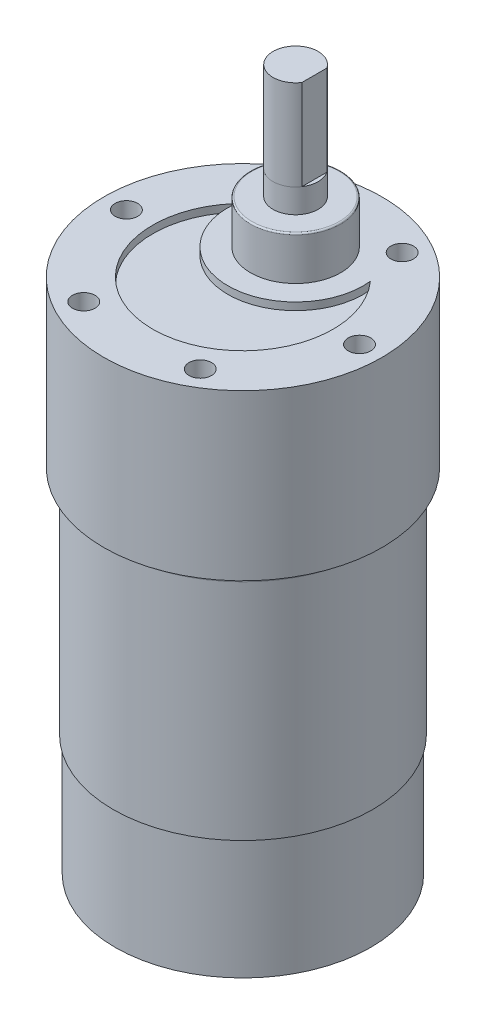
ISO-10303-21;
HEADER;
FILE_DESCRIPTION(('STEP AP214'),'2;1');
FILE_NAME('part.step','',(''),(''),'','','');
FILE_SCHEMA(('AUTOMOTIVE_DESIGN { 1 0 10303 214 1 1 1 1 }'));
ENDSEC;
DATA;
#1=APPLICATION_CONTEXT('core data for automotive mechanical design processes');
#2=APPLICATION_PROTOCOL_DEFINITION('international standard','automotive_design',2000,#1);
#3=PRODUCT_CONTEXT('',#1,'mechanical');
#4=PRODUCT('Part','Part','',(#3));
#5=PRODUCT_RELATED_PRODUCT_CATEGORY('part','',(#4));
#6=PRODUCT_DEFINITION_FORMATION('','',#4);
#7=PRODUCT_DEFINITION_CONTEXT('part definition',#1,'design');
#8=PRODUCT_DEFINITION('design','',#6,#7);
#9=PRODUCT_DEFINITION_SHAPE('','',#8);
#10=(LENGTH_UNIT() NAMED_UNIT(*) SI_UNIT(.MILLI.,.METRE.));
#11=(NAMED_UNIT(*) PLANE_ANGLE_UNIT() SI_UNIT($,.RADIAN.));
#12=(NAMED_UNIT(*) SI_UNIT($,.STERADIAN.) SOLID_ANGLE_UNIT());
#13=UNCERTAINTY_MEASURE_WITH_UNIT(LENGTH_MEASURE(1.E-05),#10,'distance_accuracy_value','');
#14=(GEOMETRIC_REPRESENTATION_CONTEXT(3) GLOBAL_UNCERTAINTY_ASSIGNED_CONTEXT((#13)) GLOBAL_UNIT_ASSIGNED_CONTEXT((#10,
#11,#12)) REPRESENTATION_CONTEXT('',''));
#15=CARTESIAN_POINT('',(0.,0.,0.));
#16=DIRECTION('',(0.,0.,1.));
#17=DIRECTION('',(1.,0.,0.));
#18=AXIS2_PLACEMENT_3D('',#15,#16,#17);
#19=CARTESIAN_POINT('',(0.,-16.,0.));
#20=DIRECTION('',(0.,1.,0.));
#21=DIRECTION('',(0.,0.,1.));
#22=AXIS2_PLACEMENT_3D('',#19,#20,#21);
#23=CYLINDRICAL_SURFACE('',#22,17.);
#24=CARTESIAN_POINT('',(0.,-16.,0.));
#25=DIRECTION('',(0.,-1.,0.));
#26=DIRECTION('',(0.,0.,-1.));
#27=AXIS2_PLACEMENT_3D('',#24,#25,#26);
#28=CIRCLE('',#27,17.);
#29=CARTESIAN_POINT('',(0.,-16.,-17.));
#30=VERTEX_POINT('',#29);
#31=EDGE_CURVE('E11',#30,#30,#28,.T.);
#32=ORIENTED_EDGE('',*,*,#31,.F.);
#33=EDGE_LOOP('',(#32));
#34=FACE_BOUND('',#33,.T.);
#35=CARTESIAN_POINT('',(0.,0.,0.));
#36=DIRECTION('',(0.,-1.,0.));
#37=DIRECTION('',(0.,0.,-1.));
#38=AXIS2_PLACEMENT_3D('',#35,#36,#37);
#39=CIRCLE('',#38,17.);
#40=CARTESIAN_POINT('',(0.,0.,-17.));
#41=VERTEX_POINT('',#40);
#42=EDGE_CURVE('E55',#41,#41,#39,.T.);
#43=ORIENTED_EDGE('',*,*,#42,.T.);
#44=EDGE_LOOP('',(#43));
#45=FACE_BOUND('',#44,.T.);
#46=ADVANCED_FACE('F52',(#34,#45),#23,.T.);
#47=CARTESIAN_POINT('',(0.,-16.,0.));
#48=DIRECTION('',(0.,-1.,0.));
#49=DIRECTION('',(0.,0.,-1.));
#50=AXIS2_PLACEMENT_3D('',#47,#48,#49);
#51=PLANE('',#50);
#52=ORIENTED_EDGE('',*,*,#31,.T.);
#53=EDGE_LOOP('',(#52));
#54=FACE_BOUND('',#53,.T.);
#55=ADVANCED_FACE('F67',(#54),#51,.T.);
#56=CARTESIAN_POINT('',(0.,0.,0.));
#57=DIRECTION('',(0.,-1.,0.));
#58=DIRECTION('',(0.,0.,-1.));
#59=AXIS2_PLACEMENT_3D('',#56,#57,#58);
#60=PLANE('',#59);
#61=ORIENTED_EDGE('',*,*,#42,.F.);
#62=EDGE_LOOP('',(#61));
#63=FACE_BOUND('',#62,.T.);
#64=ADVANCED_FACE('F65',(#63),#60,.F.);
#65=CLOSED_SHELL('',(#46,#55,#64));
#66=MANIFOLD_SOLID_BREP('B2',#65);
#67=CARTESIAN_POINT('',(0.,73.7,-7.));
#68=DIRECTION('',(0.,-1.,0.));
#69=DIRECTION('',(0.,0.,-1.));
#70=AXIS2_PLACEMENT_3D('',#67,#68,#69);
#71=CYLINDRICAL_SURFACE('',#70,3.);
#72=CARTESIAN_POINT('',(0.,61.7,-7.));
#73=DIRECTION('',(0.,1.,0.));
#74=DIRECTION('',(0.,0.,1.));
#75=AXIS2_PLACEMENT_3D('',#72,#73,#74);
#76=CIRCLE('',#75,3.);
#77=CARTESIAN_POINT('',(2.5,61.7,-8.6583123951777));
#78=VERTEX_POINT('',#77);
#79=CARTESIAN_POINT('',(2.5,61.7,-5.3416876048223));
#80=VERTEX_POINT('',#79);
#81=EDGE_CURVE('E134',#78,#80,#76,.T.);
#82=ORIENTED_EDGE('',*,*,#81,.T.);
#83=DIRECTION('',(0.,-1.,0.));
#84=VECTOR('',#83,1.);
#85=CARTESIAN_POINT('',(2.5,73.7,-5.3416876048223));
#86=LINE('',#85,#84);
#87=CARTESIAN_POINT('',(2.5,73.7,-5.3416876048223));
#88=VERTEX_POINT('',#87);
#89=EDGE_CURVE('E50',#88,#80,#86,.T.);
#90=ORIENTED_EDGE('',*,*,#89,.F.);
#91=CARTESIAN_POINT('',(0.,73.7,-7.));
#92=DIRECTION('',(0.,1.,0.));
#93=DIRECTION('',(0.,0.,1.));
#94=AXIS2_PLACEMENT_3D('',#91,#92,#93);
#95=CIRCLE('',#94,3.);
#96=CARTESIAN_POINT('',(2.5,73.7,-8.6583123951777));
#97=VERTEX_POINT('',#96);
#98=EDGE_CURVE('E133',#97,#88,#95,.T.);
#99=ORIENTED_EDGE('',*,*,#98,.F.);
#100=DIRECTION('',(0.,-1.,0.));
#101=VECTOR('',#100,1.);
#102=CARTESIAN_POINT('',(2.5,73.7,-8.6583123951777));
#103=LINE('',#102,#101);
#104=EDGE_CURVE('E111',#97,#78,#103,.T.);
#105=ORIENTED_EDGE('',*,*,#104,.T.);
#106=EDGE_LOOP('',(#82,#90,#99,#105));
#107=FACE_BOUND('',#106,.T.);
#108=ADVANCED_FACE('F103',(#107),#71,.T.);
#109=CARTESIAN_POINT('',(2.5,73.7,-8.6583123951777));
#110=DIRECTION('',(-1.,0.,0.));
#111=DIRECTION('',(0.,0.,1.));
#112=AXIS2_PLACEMENT_3D('',#109,#110,#111);
#113=PLANE('',#112);
#114=DIRECTION('',(0.,0.,-1.));
#115=VECTOR('',#114,1.);
#116=CARTESIAN_POINT('',(2.5,61.7,-8.6583123951777));
#117=LINE('',#116,#115);
#118=EDGE_CURVE('E126',#80,#78,#117,.T.);
#119=ORIENTED_EDGE('',*,*,#118,.T.);
#120=ORIENTED_EDGE('',*,*,#104,.F.);
#121=DIRECTION('',(0.,0.,-1.));
#122=VECTOR('',#121,1.);
#123=CARTESIAN_POINT('',(2.5,73.7,-8.6583123951777));
#124=LINE('',#123,#122);
#125=EDGE_CURVE('E118',#88,#97,#124,.T.);
#126=ORIENTED_EDGE('',*,*,#125,.F.);
#127=ORIENTED_EDGE('',*,*,#89,.T.);
#128=EDGE_LOOP('',(#119,#120,#126,#127));
#129=FACE_BOUND('',#128,.T.);
#130=ADVANCED_FACE('F129',(#129),#113,.F.);
#131=CARTESIAN_POINT('',(0.,73.7,-7.));
#132=DIRECTION('',(0.,1.,0.));
#133=DIRECTION('',(0.,0.,1.));
#134=AXIS2_PLACEMENT_3D('',#131,#132,#133);
#135=PLANE('',#134);
#136=ORIENTED_EDGE('',*,*,#98,.T.);
#137=ORIENTED_EDGE('',*,*,#125,.T.);
#138=EDGE_LOOP('',(#136,#137));
#139=FACE_BOUND('',#138,.T.);
#140=ADVANCED_FACE('F141',(#139),#135,.T.);
#141=CARTESIAN_POINT('',(0.,61.7,-7.));
#142=DIRECTION('',(0.,1.,0.));
#143=DIRECTION('',(0.,0.,1.));
#144=AXIS2_PLACEMENT_3D('',#141,#142,#143);
#145=PLANE('',#144);
#146=ORIENTED_EDGE('',*,*,#81,.F.);
#147=ORIENTED_EDGE('',*,*,#118,.F.);
#148=EDGE_LOOP('',(#146,#147));
#149=FACE_BOUND('',#148,.T.);
#150=ADVANCED_FACE('F137',(#149),#145,.F.);
#151=CLOSED_SHELL('',(#108,#130,#140,#150));
#152=MANIFOLD_SOLID_BREP('B6',#151);
#153=CARTESIAN_POINT('',(0.,61.7,-7.));
#154=DIRECTION('',(0.,-1.,0.));
#155=DIRECTION('',(0.,0.,-1.));
#156=AXIS2_PLACEMENT_3D('',#153,#154,#155);
#157=CYLINDRICAL_SURFACE('',#156,3.);
#158=CARTESIAN_POINT('',(0.,61.7,-7.));
#159=DIRECTION('',(0.,1.,0.));
#160=DIRECTION('',(0.,0.,1.));
#161=AXIS2_PLACEMENT_3D('',#158,#159,#160);
#162=CIRCLE('',#161,3.);
#163=CARTESIAN_POINT('',(0.,61.7,-4.));
#164=VERTEX_POINT('',#163);
#165=EDGE_CURVE('E102',#164,#164,#162,.T.);
#166=ORIENTED_EDGE('',*,*,#165,.F.);
#167=EDGE_LOOP('',(#166));
#168=FACE_BOUND('',#167,.T.);
#169=CARTESIAN_POINT('',(0.,58.5,-7.));
#170=DIRECTION('',(0.,1.,0.));
#171=DIRECTION('',(0.,0.,1.));
#172=AXIS2_PLACEMENT_3D('',#169,#170,#171);
#173=CIRCLE('',#172,3.);
#174=CARTESIAN_POINT('',(0.,58.5,-4.));
#175=VERTEX_POINT('',#174);
#176=EDGE_CURVE('E188',#175,#175,#173,.T.);
#177=ORIENTED_EDGE('',*,*,#176,.T.);
#178=EDGE_LOOP('',(#177));
#179=FACE_BOUND('',#178,.T.);
#180=ADVANCED_FACE('F185',(#168,#179),#157,.T.);
#181=CARTESIAN_POINT('',(0.,61.7,-7.));
#182=DIRECTION('',(0.,1.,0.));
#183=DIRECTION('',(0.,0.,1.));
#184=AXIS2_PLACEMENT_3D('',#181,#182,#183);
#185=PLANE('',#184);
#186=ORIENTED_EDGE('',*,*,#165,.T.);
#187=EDGE_LOOP('',(#186));
#188=FACE_BOUND('',#187,.T.);
#189=ADVANCED_FACE('F200',(#188),#185,.T.);
#190=CARTESIAN_POINT('',(0.,58.5,-7.));
#191=DIRECTION('',(0.,1.,0.));
#192=DIRECTION('',(0.,0.,1.));
#193=AXIS2_PLACEMENT_3D('',#190,#191,#192);
#194=PLANE('',#193);
#195=ORIENTED_EDGE('',*,*,#176,.F.);
#196=EDGE_LOOP('',(#195));
#197=FACE_BOUND('',#196,.T.);
#198=ADVANCED_FACE('F198',(#197),#194,.F.);
#199=CLOSED_SHELL('',(#180,#189,#198));
#200=MANIFOLD_SOLID_BREP('B44',#199);
#201=CARTESIAN_POINT('',(0.,58.5,-7.));
#202=DIRECTION('',(0.,-1.,0.));
#203=DIRECTION('',(0.,0.,-1.));
#204=AXIS2_PLACEMENT_3D('',#201,#202,#203);
#205=CYLINDRICAL_SURFACE('',#204,6.);
#206=CARTESIAN_POINT('',(0.,58.3,-7.));
#207=DIRECTION('',(0.,1.,0.));
#208=DIRECTION('',(0.,0.,1.));
#209=AXIS2_PLACEMENT_3D('',#206,#207,#208);
#210=CIRCLE('',#209,6.);
#211=CARTESIAN_POINT('',(0.,58.3,-0.999999999999999));
#212=VERTEX_POINT('',#211);
#213=EDGE_CURVE('E184',#212,#212,#210,.F.);
#214=ORIENTED_EDGE('',*,*,#213,.T.);
#215=EDGE_LOOP('',(#214));
#216=FACE_BOUND('',#215,.T.);
#217=CARTESIAN_POINT('',(0.,52.7,-7.));
#218=DIRECTION('',(0.,1.,0.));
#219=DIRECTION('',(0.,0.,1.));
#220=AXIS2_PLACEMENT_3D('',#217,#218,#219);
#221=CIRCLE('',#220,6.);
#222=CARTESIAN_POINT('',(0.,52.7,-0.999999999999999));
#223=VERTEX_POINT('',#222);
#224=EDGE_CURVE('E249',#223,#223,#221,.T.);
#225=ORIENTED_EDGE('',*,*,#224,.T.);
#226=EDGE_LOOP('',(#225));
#227=FACE_BOUND('',#226,.T.);
#228=ADVANCED_FACE('F238',(#216,#227),#205,.T.);
#229=CARTESIAN_POINT('',(0.,58.5,-7.));
#230=DIRECTION('',(0.,1.,0.));
#231=DIRECTION('',(0.,0.,1.));
#232=AXIS2_PLACEMENT_3D('',#229,#230,#231);
#233=PLANE('',#232);
#234=CARTESIAN_POINT('',(0.,58.5,-7.));
#235=DIRECTION('',(0.,1.,0.));
#236=DIRECTION('',(0.,0.,1.));
#237=AXIS2_PLACEMENT_3D('',#234,#235,#236);
#238=CIRCLE('',#237,5.8);
#239=CARTESIAN_POINT('',(0.,58.5,-1.2));
#240=VERTEX_POINT('',#239);
#241=EDGE_CURVE('E245',#240,#240,#238,.T.);
#242=ORIENTED_EDGE('',*,*,#241,.T.);
#243=EDGE_LOOP('',(#242));
#244=FACE_BOUND('',#243,.T.);
#245=ADVANCED_FACE('F259',(#244),#233,.T.);
#246=CARTESIAN_POINT('',(0.,52.7,-7.));
#247=DIRECTION('',(0.,1.,0.));
#248=DIRECTION('',(0.,0.,1.));
#249=AXIS2_PLACEMENT_3D('',#246,#247,#248);
#250=PLANE('',#249);
#251=ORIENTED_EDGE('',*,*,#224,.F.);
#252=EDGE_LOOP('',(#251));
#253=FACE_BOUND('',#252,.T.);
#254=ADVANCED_FACE('F257',(#253),#250,.F.);
#255=CARTESIAN_POINT('',(0.,58.3,-7.));
#256=DIRECTION('',(0.,1.,0.));
#257=DIRECTION('',(0.,0.,1.));
#258=AXIS2_PLACEMENT_3D('',#255,#256,#257);
#259=TOROIDAL_SURFACE('',#258,5.8,0.2);
#260=ORIENTED_EDGE('',*,*,#213,.F.);
#261=EDGE_LOOP('',(#260));
#262=FACE_BOUND('',#261,.T.);
#263=ORIENTED_EDGE('',*,*,#241,.F.);
#264=EDGE_LOOP('',(#263));
#265=FACE_BOUND('',#264,.T.);
#266=ADVANCED_FACE('F240',(#262,#265),#259,.T.);
#267=CLOSED_SHELL('',(#228,#245,#254,#266));
#268=MANIFOLD_SOLID_BREP('B97',#267);
#269=CARTESIAN_POINT('',(0.,52.7,0.));
#270=DIRECTION('',(0.,-1.,0.));
#271=DIRECTION('',(0.,0.,-1.));
#272=AXIS2_PLACEMENT_3D('',#269,#270,#271);
#273=CYLINDRICAL_SURFACE('',#272,18.5);
#274=CARTESIAN_POINT('',(0.,52.7,0.));
#275=DIRECTION('',(0.,1.,0.));
#276=DIRECTION('',(0.,0.,1.));
#277=AXIS2_PLACEMENT_3D('',#274,#275,#276);
#278=CIRCLE('',#277,18.5);
#279=CARTESIAN_POINT('',(0.,52.7,18.5));
#280=VERTEX_POINT('',#279);
#281=EDGE_CURVE('E236',#280,#280,#278,.T.);
#282=ORIENTED_EDGE('',*,*,#281,.F.);
#283=EDGE_LOOP('',(#282));
#284=FACE_BOUND('',#283,.T.);
#285=CARTESIAN_POINT('',(0.,30.8,0.));
#286=DIRECTION('',(0.,1.,0.));
#287=DIRECTION('',(0.,0.,1.));
#288=AXIS2_PLACEMENT_3D('',#285,#286,#287);
#289=CIRCLE('',#288,18.5);
#290=CARTESIAN_POINT('',(0.,30.8,18.5));
#291=VERTEX_POINT('',#290);
#292=EDGE_CURVE('E306',#291,#291,#289,.T.);
#293=ORIENTED_EDGE('',*,*,#292,.T.);
#294=EDGE_LOOP('',(#293));
#295=FACE_BOUND('',#294,.T.);
#296=ADVANCED_FACE('F303',(#284,#295),#273,.T.);
#297=CARTESIAN_POINT('',(0.,52.7,0.));
#298=DIRECTION('',(0.,1.,0.));
#299=DIRECTION('',(0.,0.,1.));
#300=AXIS2_PLACEMENT_3D('',#297,#298,#299);
#301=PLANE('',#300);
#302=CARTESIAN_POINT('',(0.,52.7,-7.));
#303=DIRECTION('',(0.,-1.,0.));
#304=DIRECTION('',(0.,0.,1.));
#305=AXIS2_PLACEMENT_3D('',#302,#303,#304);
#306=CIRCLE('',#305,9.);
#307=CARTESIAN_POINT('',(8.94427190999916,52.7,-8.));
#308=VERTEX_POINT('',#307);
#309=CARTESIAN_POINT('',(-8.94427190999916,52.7,-8.));
#310=VERTEX_POINT('',#309);
#311=EDGE_CURVE('E317',#308,#310,#306,.T.);
#312=ORIENTED_EDGE('',*,*,#311,.F.);
#313=CARTESIAN_POINT('',(0.,52.7,0.));
#314=DIRECTION('',(0.,1.,0.));
#315=DIRECTION('',(0.,0.,1.));
#316=AXIS2_PLACEMENT_3D('',#313,#314,#315);
#317=CIRCLE('',#316,12.);
#318=EDGE_CURVE('E337',#310,#308,#317,.T.);
#319=ORIENTED_EDGE('',*,*,#318,.F.);
#320=EDGE_LOOP('',(#312,#319));
#321=FACE_BOUND('',#320,.T.);
#322=CARTESIAN_POINT('',(15.5,52.7,0.));
#323=DIRECTION('',(0.,1.,0.));
#324=DIRECTION('',(0.,0.,1.));
#325=AXIS2_PLACEMENT_3D('',#322,#323,#324);
#326=CIRCLE('',#325,1.5);
#327=CARTESIAN_POINT('',(15.5,52.7,1.5));
#328=VERTEX_POINT('',#327);
#329=EDGE_CURVE('E352',#328,#328,#326,.T.);
#330=ORIENTED_EDGE('',*,*,#329,.F.);
#331=EDGE_LOOP('',(#330));
#332=FACE_BOUND('',#331,.T.);
#333=CARTESIAN_POINT('',(-7.74999999999997,52.7,-13.4233937586588));
#334=DIRECTION('',(0.,1.,0.));
#335=DIRECTION('',(0.,0.,-1.));
#336=AXIS2_PLACEMENT_3D('',#333,#334,#335);
#337=CIRCLE('',#336,1.5);
#338=CARTESIAN_POINT('',(-7.74999999999997,52.7,-14.9233937586588));
#339=VERTEX_POINT('',#338);
#340=EDGE_CURVE('E333',#339,#339,#337,.T.);
#341=ORIENTED_EDGE('',*,*,#340,.F.);
#342=EDGE_LOOP('',(#341));
#343=FACE_BOUND('',#342,.T.);
#344=CARTESIAN_POINT('',(-15.5,52.7,0.));
#345=DIRECTION('',(0.,1.,0.));
#346=DIRECTION('',(0.,0.,-1.));
#347=AXIS2_PLACEMENT_3D('',#344,#345,#346);
#348=CIRCLE('',#347,1.5);
#349=CARTESIAN_POINT('',(-15.5,52.7,-1.5));
#350=VERTEX_POINT('',#349);
#351=EDGE_CURVE('E359',#350,#350,#348,.T.);
#352=ORIENTED_EDGE('',*,*,#351,.F.);
#353=EDGE_LOOP('',(#352));
#354=FACE_BOUND('',#353,.T.);
#355=CARTESIAN_POINT('',(-7.74999999999996,52.7,13.4233937586588));
#356=DIRECTION('',(0.,1.,0.));
#357=DIRECTION('',(0.,0.,1.));
#358=AXIS2_PLACEMENT_3D('',#355,#356,#357);
#359=CIRCLE('',#358,1.5);
#360=CARTESIAN_POINT('',(-7.74999999999996,52.7,14.9233937586588));
#361=VERTEX_POINT('',#360);
#362=EDGE_CURVE('E376',#361,#361,#359,.T.);
#363=ORIENTED_EDGE('',*,*,#362,.F.);
#364=EDGE_LOOP('',(#363));
#365=FACE_BOUND('',#364,.T.);
#366=CARTESIAN_POINT('',(7.74999999999996,52.7,13.4233937586588));
#367=DIRECTION('',(0.,1.,0.));
#368=DIRECTION('',(0.,0.,-1.));
#369=AXIS2_PLACEMENT_3D('',#366,#367,#368);
#370=CIRCLE('',#369,1.5);
#371=CARTESIAN_POINT('',(7.74999999999996,52.7,11.9233937586588));
#372=VERTEX_POINT('',#371);
#373=EDGE_CURVE('E370',#372,#372,#370,.T.);
#374=ORIENTED_EDGE('',*,*,#373,.F.);
#375=EDGE_LOOP('',(#374));
#376=FACE_BOUND('',#375,.T.);
#377=CARTESIAN_POINT('',(7.74999999999997,52.7,-13.4233937586588));
#378=DIRECTION('',(0.,1.,0.));
#379=DIRECTION('',(0.,0.,1.));
#380=AXIS2_PLACEMENT_3D('',#377,#378,#379);
#381=CIRCLE('',#380,1.5);
#382=CARTESIAN_POINT('',(7.74999999999997,52.7,-11.9233937586588));
#383=VERTEX_POINT('',#382);
#384=EDGE_CURVE('E364',#383,#383,#381,.T.);
#385=ORIENTED_EDGE('',*,*,#384,.F.);
#386=EDGE_LOOP('',(#385));
#387=FACE_BOUND('',#386,.T.);
#388=ORIENTED_EDGE('',*,*,#281,.T.);
#389=EDGE_LOOP('',(#388));
#390=FACE_BOUND('',#389,.T.);
#391=ADVANCED_FACE('F341',(#321,#332,#343,#354,#365,#376,#387,#390),#301,.T.);
#392=CARTESIAN_POINT('',(0.,30.8,0.));
#393=DIRECTION('',(0.,1.,0.));
#394=DIRECTION('',(0.,0.,1.));
#395=AXIS2_PLACEMENT_3D('',#392,#393,#394);
#396=PLANE('',#395);
#397=ORIENTED_EDGE('',*,*,#292,.F.);
#398=EDGE_LOOP('',(#397));
#399=FACE_BOUND('',#398,.T.);
#400=ADVANCED_FACE('F389',(#399),#396,.F.);
#401=CARTESIAN_POINT('',(7.74999999999997,49.7,-13.4233937586588));
#402=DIRECTION('',(0.,1.,0.));
#403=DIRECTION('',(0.,0.,1.));
#404=AXIS2_PLACEMENT_3D('',#401,#402,#403);
#405=CYLINDRICAL_SURFACE('',#404,1.5);
#406=CARTESIAN_POINT('',(7.74999999999997,49.7,-13.4233937586588));
#407=DIRECTION('',(0.,1.,0.));
#408=DIRECTION('',(0.,0.,1.));
#409=AXIS2_PLACEMENT_3D('',#406,#407,#408);
#410=CIRCLE('',#409,1.5);
#411=CARTESIAN_POINT('',(7.74999999999997,49.7,-11.9233937586588));
#412=VERTEX_POINT('',#411);
#413=EDGE_CURVE('E355',#412,#412,#410,.T.);
#414=ORIENTED_EDGE('',*,*,#413,.F.);
#415=EDGE_LOOP('',(#414));
#416=FACE_BOUND('',#415,.T.);
#417=ORIENTED_EDGE('',*,*,#384,.T.);
#418=EDGE_LOOP('',(#417));
#419=FACE_BOUND('',#418,.T.);
#420=ADVANCED_FACE('F405',(#416,#419),#405,.F.);
#421=CARTESIAN_POINT('',(7.74999999999997,49.7,-13.4233937586588));
#422=DIRECTION('',(0.,1.,0.));
#423=DIRECTION('',(0.,0.,1.));
#424=AXIS2_PLACEMENT_3D('',#421,#422,#423);
#425=PLANE('',#424);
#426=ORIENTED_EDGE('',*,*,#413,.T.);
#427=EDGE_LOOP('',(#426));
#428=FACE_BOUND('',#427,.T.);
#429=ADVANCED_FACE('F409',(#428),#425,.T.);
#430=CARTESIAN_POINT('',(7.74999999999996,49.7,13.4233937586588));
#431=DIRECTION('',(0.,1.,0.));
#432=DIRECTION('',(0.,0.,1.));
#433=AXIS2_PLACEMENT_3D('',#430,#431,#432);
#434=CYLINDRICAL_SURFACE('',#433,1.5);
#435=CARTESIAN_POINT('',(7.74999999999996,49.7,13.4233937586588));
#436=DIRECTION('',(0.,1.,0.));
#437=DIRECTION('',(0.,0.,-1.));
#438=AXIS2_PLACEMENT_3D('',#435,#436,#437);
#439=CIRCLE('',#438,1.5);
#440=CARTESIAN_POINT('',(7.74999999999996,49.7,11.9233937586588));
#441=VERTEX_POINT('',#440);
#442=EDGE_CURVE('E367',#441,#441,#439,.T.);
#443=ORIENTED_EDGE('',*,*,#442,.F.);
#444=EDGE_LOOP('',(#443));
#445=FACE_BOUND('',#444,.T.);
#446=ORIENTED_EDGE('',*,*,#373,.T.);
#447=EDGE_LOOP('',(#446));
#448=FACE_BOUND('',#447,.T.);
#449=ADVANCED_FACE('F430',(#445,#448),#434,.F.);
#450=CARTESIAN_POINT('',(7.74999999999996,49.7,13.4233937586588));
#451=DIRECTION('',(0.,-1.,0.));
#452=DIRECTION('',(0.,0.,-1.));
#453=AXIS2_PLACEMENT_3D('',#450,#451,#452);
#454=PLANE('',#453);
#455=ORIENTED_EDGE('',*,*,#442,.T.);
#456=EDGE_LOOP('',(#455));
#457=FACE_BOUND('',#456,.T.);
#458=ADVANCED_FACE('F425',(#457),#454,.F.);
#459=CARTESIAN_POINT('',(-7.74999999999996,49.7,13.4233937586588));
#460=DIRECTION('',(0.,1.,0.));
#461=DIRECTION('',(0.,0.,1.));
#462=AXIS2_PLACEMENT_3D('',#459,#460,#461);
#463=CYLINDRICAL_SURFACE('',#462,1.5);
#464=CARTESIAN_POINT('',(-7.74999999999996,49.7,13.4233937586588));
#465=DIRECTION('',(0.,1.,0.));
#466=DIRECTION('',(0.,0.,1.));
#467=AXIS2_PLACEMENT_3D('',#464,#465,#466);
#468=CIRCLE('',#467,1.5);
#469=CARTESIAN_POINT('',(-7.74999999999996,49.7,14.9233937586588));
#470=VERTEX_POINT('',#469);
#471=EDGE_CURVE('E373',#470,#470,#468,.T.);
#472=ORIENTED_EDGE('',*,*,#471,.F.);
#473=EDGE_LOOP('',(#472));
#474=FACE_BOUND('',#473,.T.);
#475=ORIENTED_EDGE('',*,*,#362,.T.);
#476=EDGE_LOOP('',(#475));
#477=FACE_BOUND('',#476,.T.);
#478=ADVANCED_FACE('F422',(#474,#477),#463,.F.);
#479=CARTESIAN_POINT('',(-7.74999999999996,49.7,13.4233937586588));
#480=DIRECTION('',(0.,1.,0.));
#481=DIRECTION('',(0.,0.,1.));
#482=AXIS2_PLACEMENT_3D('',#479,#480,#481);
#483=PLANE('',#482);
#484=ORIENTED_EDGE('',*,*,#471,.T.);
#485=EDGE_LOOP('',(#484));
#486=FACE_BOUND('',#485,.T.);
#487=ADVANCED_FACE('F416',(#486),#483,.T.);
#488=CARTESIAN_POINT('',(-15.5,49.7,0.));
#489=DIRECTION('',(0.,1.,0.));
#490=DIRECTION('',(0.,0.,1.));
#491=AXIS2_PLACEMENT_3D('',#488,#489,#490);
#492=CYLINDRICAL_SURFACE('',#491,1.5);
#493=CARTESIAN_POINT('',(-15.5,49.7,0.));
#494=DIRECTION('',(0.,1.,0.));
#495=DIRECTION('',(0.,0.,-1.));
#496=AXIS2_PLACEMENT_3D('',#493,#494,#495);
#497=CIRCLE('',#496,1.5);
#498=CARTESIAN_POINT('',(-15.5,49.7,-1.5));
#499=VERTEX_POINT('',#498);
#500=EDGE_CURVE('E379',#499,#499,#497,.T.);
#501=ORIENTED_EDGE('',*,*,#500,.F.);
#502=EDGE_LOOP('',(#501));
#503=FACE_BOUND('',#502,.T.);
#504=ORIENTED_EDGE('',*,*,#351,.T.);
#505=EDGE_LOOP('',(#504));
#506=FACE_BOUND('',#505,.T.);
#507=ADVANCED_FACE('F385',(#503,#506),#492,.F.);
#508=CARTESIAN_POINT('',(-15.5,49.7,0.));
#509=DIRECTION('',(0.,-1.,0.));
#510=DIRECTION('',(0.,0.,-1.));
#511=AXIS2_PLACEMENT_3D('',#508,#509,#510);
#512=PLANE('',#511);
#513=ORIENTED_EDGE('',*,*,#500,.T.);
#514=EDGE_LOOP('',(#513));
#515=FACE_BOUND('',#514,.T.);
#516=ADVANCED_FACE('F415',(#515),#512,.F.);
#517=CARTESIAN_POINT('',(-7.74999999999997,49.7,-13.4233937586588));
#518=DIRECTION('',(0.,1.,0.));
#519=DIRECTION('',(0.,0.,1.));
#520=AXIS2_PLACEMENT_3D('',#517,#518,#519);
#521=CYLINDRICAL_SURFACE('',#520,1.5);
#522=CARTESIAN_POINT('',(-7.74999999999997,49.7,-13.4233937586588));
#523=DIRECTION('',(0.,1.,0.));
#524=DIRECTION('',(0.,0.,-1.));
#525=AXIS2_PLACEMENT_3D('',#522,#523,#524);
#526=CIRCLE('',#525,1.5);
#527=CARTESIAN_POINT('',(-7.74999999999997,49.7,-14.9233937586588));
#528=VERTEX_POINT('',#527);
#529=EDGE_CURVE('E356',#528,#528,#526,.T.);
#530=ORIENTED_EDGE('',*,*,#529,.F.);
#531=EDGE_LOOP('',(#530));
#532=FACE_BOUND('',#531,.T.);
#533=ORIENTED_EDGE('',*,*,#340,.T.);
#534=EDGE_LOOP('',(#533));
#535=FACE_BOUND('',#534,.T.);
#536=ADVANCED_FACE('F420',(#532,#535),#521,.F.);
#537=CARTESIAN_POINT('',(-7.74999999999997,49.7,-13.4233937586588));
#538=DIRECTION('',(0.,-1.,0.));
#539=DIRECTION('',(0.,0.,-1.));
#540=AXIS2_PLACEMENT_3D('',#537,#538,#539);
#541=PLANE('',#540);
#542=ORIENTED_EDGE('',*,*,#529,.T.);
#543=EDGE_LOOP('',(#542));
#544=FACE_BOUND('',#543,.T.);
#545=ADVANCED_FACE('F442',(#544),#541,.F.);
#546=CARTESIAN_POINT('',(15.5,49.7,0.));
#547=DIRECTION('',(0.,1.,0.));
#548=DIRECTION('',(0.,0.,1.));
#549=AXIS2_PLACEMENT_3D('',#546,#547,#548);
#550=CYLINDRICAL_SURFACE('',#549,1.5);
#551=CARTESIAN_POINT('',(15.5,49.7,0.));
#552=DIRECTION('',(0.,1.,0.));
#553=DIRECTION('',(0.,0.,1.));
#554=AXIS2_PLACEMENT_3D('',#551,#552,#553);
#555=CIRCLE('',#554,1.5);
#556=CARTESIAN_POINT('',(15.5,49.7,1.5));
#557=VERTEX_POINT('',#556);
#558=EDGE_CURVE('E349',#557,#557,#555,.T.);
#559=ORIENTED_EDGE('',*,*,#558,.F.);
#560=EDGE_LOOP('',(#559));
#561=FACE_BOUND('',#560,.T.);
#562=ORIENTED_EDGE('',*,*,#329,.T.);
#563=EDGE_LOOP('',(#562));
#564=FACE_BOUND('',#563,.T.);
#565=ADVANCED_FACE('F446',(#561,#564),#550,.F.);
#566=CARTESIAN_POINT('',(15.5,49.7,0.));
#567=DIRECTION('',(0.,1.,0.));
#568=DIRECTION('',(0.,0.,1.));
#569=AXIS2_PLACEMENT_3D('',#566,#567,#568);
#570=PLANE('',#569);
#571=ORIENTED_EDGE('',*,*,#558,.T.);
#572=EDGE_LOOP('',(#571));
#573=FACE_BOUND('',#572,.T.);
#574=ADVANCED_FACE('F450',(#573),#570,.T.);
#575=CARTESIAN_POINT('',(0.,51.7,-7.));
#576=DIRECTION('',(0.,1.,0.));
#577=DIRECTION('',(0.,0.,1.));
#578=AXIS2_PLACEMENT_3D('',#575,#576,#577);
#579=CYLINDRICAL_SURFACE('',#578,9.);
#580=ORIENTED_EDGE('',*,*,#311,.T.);
#581=DIRECTION('',(0.,1.,0.));
#582=VECTOR('',#581,1.);
#583=CARTESIAN_POINT('',(-8.94427190999916,51.7,-8.00000000000001));
#584=LINE('',#583,#582);
#585=CARTESIAN_POINT('',(-8.94427190999916,51.7,-8.00000000000001));
#586=VERTEX_POINT('',#585);
#587=EDGE_CURVE('E334',#586,#310,#584,.T.);
#588=ORIENTED_EDGE('',*,*,#587,.F.);
#589=CARTESIAN_POINT('',(0.,51.7,-7.));
#590=DIRECTION('',(0.,-1.,0.));
#591=DIRECTION('',(0.,0.,1.));
#592=AXIS2_PLACEMENT_3D('',#589,#590,#591);
#593=CIRCLE('',#592,9.);
#594=CARTESIAN_POINT('',(8.94427190999916,51.7,-8.));
#595=VERTEX_POINT('',#594);
#596=EDGE_CURVE('E331',#595,#586,#593,.T.);
#597=ORIENTED_EDGE('',*,*,#596,.F.);
#598=DIRECTION('',(0.,1.,0.));
#599=VECTOR('',#598,1.);
#600=CARTESIAN_POINT('',(8.94427190999916,51.7,-8.));
#601=LINE('',#600,#599);
#602=EDGE_CURVE('E325',#595,#308,#601,.T.);
#603=ORIENTED_EDGE('',*,*,#602,.T.);
#604=EDGE_LOOP('',(#580,#588,#597,#603));
#605=FACE_BOUND('',#604,.T.);
#606=ADVANCED_FACE('F329',(#605),#579,.T.);
#607=CARTESIAN_POINT('',(0.,51.7,0.));
#608=DIRECTION('',(0.,1.,0.));
#609=DIRECTION('',(0.,0.,1.));
#610=AXIS2_PLACEMENT_3D('',#607,#608,#609);
#611=CYLINDRICAL_SURFACE('',#610,12.);
#612=ORIENTED_EDGE('',*,*,#318,.T.);
#613=ORIENTED_EDGE('',*,*,#602,.F.);
#614=CARTESIAN_POINT('',(0.,51.7,0.));
#615=DIRECTION('',(0.,1.,0.));
#616=DIRECTION('',(0.,0.,1.));
#617=AXIS2_PLACEMENT_3D('',#614,#615,#616);
#618=CIRCLE('',#617,12.);
#619=EDGE_CURVE('E345',#586,#595,#618,.T.);
#620=ORIENTED_EDGE('',*,*,#619,.F.);
#621=ORIENTED_EDGE('',*,*,#587,.T.);
#622=EDGE_LOOP('',(#612,#613,#620,#621));
#623=FACE_BOUND('',#622,.T.);
#624=ADVANCED_FACE('F338',(#623),#611,.F.);
#625=CARTESIAN_POINT('',(0.,51.7,-3.5));
#626=DIRECTION('',(0.,1.,0.));
#627=DIRECTION('',(0.,0.,1.));
#628=AXIS2_PLACEMENT_3D('',#625,#626,#627);
#629=PLANE('',#628);
#630=ORIENTED_EDGE('',*,*,#596,.T.);
#631=ORIENTED_EDGE('',*,*,#619,.T.);
#632=EDGE_LOOP('',(#630,#631));
#633=FACE_BOUND('',#632,.T.);
#634=ADVANCED_FACE('F459',(#633),#629,.T.);
#635=CLOSED_SHELL('',(#296,#391,#400,#420,#429,#449,#458,#478,#487,#507,#516,#536,#545,#565,
#574,#606,#624,#634));
#636=MANIFOLD_SOLID_BREP('B179',#635);
#637=CARTESIAN_POINT('',(0.,30.8,0.));
#638=DIRECTION('',(0.,-1.,0.));
#639=DIRECTION('',(0.,0.,-1.));
#640=AXIS2_PLACEMENT_3D('',#637,#638,#639);
#641=CYLINDRICAL_SURFACE('',#640,17.25);
#642=CARTESIAN_POINT('',(0.,29.8,0.));
#643=DIRECTION('',(0.,1.,0.));
#644=DIRECTION('',(0.,0.,1.));
#645=AXIS2_PLACEMENT_3D('',#642,#643,#644);
#646=CIRCLE('',#645,17.25);
#647=CARTESIAN_POINT('',(0.,29.8,-17.25));
#648=VERTEX_POINT('',#647);
#649=EDGE_CURVE('E302',#648,#648,#646,.F.);
#650=CARTESIAN_POINT('',(0.,0.,0.));
#651=DIRECTION('',(0.,1.,0.));
#652=DIRECTION('',(0.,0.,1.));
#653=AXIS2_PLACEMENT_3D('',#650,#651,#652);
#654=CIRCLE('',#653,17.25);
#655=CARTESIAN_POINT('',(0.,0.,-17.25));
#656=VERTEX_POINT('',#655);
#657=EDGE_CURVE('E598',#656,#656,#654,.T.);
#658=CARTESIAN_POINT('',(0.,29.8,-17.25));
#659=CARTESIAN_POINT('',(0.,29.4895833333333,-17.25));
#660=CARTESIAN_POINT('',(0.,29.1791666666667,-17.25));
#661=CARTESIAN_POINT('',(0.,28.5583333333333,-17.25));
#662=CARTESIAN_POINT('',(0.,28.2479166666667,-17.25));
#663=CARTESIAN_POINT('',(0.,27.6270833333333,-17.25));
#664=CARTESIAN_POINT('',(0.,27.3166666666667,-17.25));
#665=CARTESIAN_POINT('',(0.,26.6958333333333,-17.25));
#666=CARTESIAN_POINT('',(0.,26.3854166666667,-17.25));
#667=CARTESIAN_POINT('',(0.,25.7645833333333,-17.25));
#668=CARTESIAN_POINT('',(0.,25.4541666666667,-17.25));
#669=CARTESIAN_POINT('',(0.,24.8333333333333,-17.25));
#670=CARTESIAN_POINT('',(0.,24.5229166666667,-17.25));
#671=CARTESIAN_POINT('',(0.,23.9020833333333,-17.25));
#672=CARTESIAN_POINT('',(0.,23.5916666666667,-17.25));
#673=CARTESIAN_POINT('',(0.,22.9708333333333,-17.25));
#674=CARTESIAN_POINT('',(0.,22.6604166666667,-17.25));
#675=CARTESIAN_POINT('',(0.,22.0395833333333,-17.25));
#676=CARTESIAN_POINT('',(0.,21.7291666666667,-17.25));
#677=CARTESIAN_POINT('',(0.,21.1083333333333,-17.25));
#678=CARTESIAN_POINT('',(0.,20.7979166666667,-17.25));
#679=CARTESIAN_POINT('',(0.,20.1770833333333,-17.25));
#680=CARTESIAN_POINT('',(0.,19.8666666666667,-17.25));
#681=CARTESIAN_POINT('',(0.,19.2458333333333,-17.25));
#682=CARTESIAN_POINT('',(0.,18.9354166666667,-17.25));
#683=CARTESIAN_POINT('',(0.,18.3145833333333,-17.25));
#684=CARTESIAN_POINT('',(0.,18.0041666666667,-17.25));
#685=CARTESIAN_POINT('',(0.,17.3833333333333,-17.25));
#686=CARTESIAN_POINT('',(0.,17.0729166666667,-17.25));
#687=CARTESIAN_POINT('',(0.,16.4520833333333,-17.25));
#688=CARTESIAN_POINT('',(0.,16.1416666666667,-17.25));
#689=CARTESIAN_POINT('',(0.,15.5208333333333,-17.25));
#690=CARTESIAN_POINT('',(0.,15.2104166666667,-17.25));
#691=CARTESIAN_POINT('',(0.,14.5895833333333,-17.25));
#692=CARTESIAN_POINT('',(0.,14.2791666666667,-17.25));
#693=CARTESIAN_POINT('',(0.,13.6583333333333,-17.25));
#694=CARTESIAN_POINT('',(0.,13.3479166666667,-17.25));
#695=CARTESIAN_POINT('',(0.,12.7270833333333,-17.25));
#696=CARTESIAN_POINT('',(0.,12.4166666666667,-17.25));
#697=CARTESIAN_POINT('',(0.,11.7958333333333,-17.25));
#698=CARTESIAN_POINT('',(0.,11.4854166666667,-17.25));
#699=CARTESIAN_POINT('',(0.,10.8645833333333,-17.25));
#700=CARTESIAN_POINT('',(0.,10.5541666666667,-17.25));
#701=CARTESIAN_POINT('',(0.,9.93333333333333,-17.25));
#702=CARTESIAN_POINT('',(0.,9.62291666666667,-17.25));
#703=CARTESIAN_POINT('',(0.,9.00208333333333,-17.25));
#704=CARTESIAN_POINT('',(0.,8.69166666666666,-17.25));
#705=CARTESIAN_POINT('',(0.,8.07083333333333,-17.25));
#706=CARTESIAN_POINT('',(0.,7.76041666666666,-17.25));
#707=CARTESIAN_POINT('',(0.,7.13958333333333,-17.25));
#708=CARTESIAN_POINT('',(0.,6.82916666666666,-17.25));
#709=CARTESIAN_POINT('',(0.,6.20833333333333,-17.25));
#710=CARTESIAN_POINT('',(0.,5.89791666666667,-17.25));
#711=CARTESIAN_POINT('',(0.,5.27708333333333,-17.25));
#712=CARTESIAN_POINT('',(0.,4.96666666666666,-17.25));
#713=CARTESIAN_POINT('',(0.,4.34583333333333,-17.25));
#714=CARTESIAN_POINT('',(0.,4.03541666666666,-17.25));
#715=CARTESIAN_POINT('',(0.,3.41458333333333,-17.25));
#716=CARTESIAN_POINT('',(0.,3.10416666666666,-17.25));
#717=CARTESIAN_POINT('',(0.,2.48333333333333,-17.25));
#718=CARTESIAN_POINT('',(0.,2.17291666666666,-17.25));
#719=CARTESIAN_POINT('',(0.,1.55208333333333,-17.25));
#720=CARTESIAN_POINT('',(0.,1.24166666666666,-17.25));
#721=CARTESIAN_POINT('',(0.,0.620833333333331,-17.25));
#722=CARTESIAN_POINT('',(0.,0.310416666666664,-17.25));
#723=CARTESIAN_POINT('',(0.,0.,-17.25));
#724=B_SPLINE_CURVE_WITH_KNOTS('',3,(#658,#659,#660,#661,#662,#663,#664,#665,#666,#667,#668,
#669,#670,#671,#672,#673,#674,#675,#676,#677,#678,#679,#680,#681,#682,#683,#684,#685,#686,#687,
#688,#689,#690,#691,#692,#693,#694,#695,#696,#697,#698,#699,#700,#701,#702,#703,#704,#705,#706,
#707,#708,#709,#710,#711,#712,#713,#714,#715,#716,#717,#718,#719,#720,#721,#722,#723),
.UNSPECIFIED.,.F.,.F.,(4,2,2,2,2,2,2,2,2,2,2,2,2,2,2,2,2,2,2,2,2,2,2,2,2,2,2,2,2,2,2,2,4),(0.,
0.931249999999998,1.8625,2.79375,3.725,4.65625,5.5875,6.51875,7.45,8.38125,9.3125,10.24375,
11.175,12.10625,13.0375,13.96875,14.9,15.83125,16.7625,17.69375,18.625,19.55625,20.4875,
21.41875,22.35,23.28125,24.2125,25.14375,26.075,27.00625,27.9375,28.86875,29.8),.UNSPECIFIED.);
#725=EDGE_CURVE('BSEAM587',#648,#656,#724,.T.);
#726=ORIENTED_EDGE('',*,*,#649,.T.);
#727=ORIENTED_EDGE('',*,*,#657,.T.);
#728=ORIENTED_EDGE('',*,*,#725,.T.);
#729=ORIENTED_EDGE('',*,*,#725,.F.);
#730=EDGE_LOOP('',(#726,#728,#727,#729));
#731=FACE_BOUND('',#730,.T.);
#732=ADVANCED_FACE('F587',(#731),#641,.T.);
#733=CARTESIAN_POINT('',(0.,30.8,0.));
#734=DIRECTION('',(0.,1.,0.));
#735=DIRECTION('',(0.,0.,1.));
#736=AXIS2_PLACEMENT_3D('',#733,#734,#735);
#737=PLANE('',#736);
#738=CARTESIAN_POINT('',(0.,30.8,0.));
#739=DIRECTION('',(0.,1.,0.));
#740=DIRECTION('',(0.,0.,1.));
#741=AXIS2_PLACEMENT_3D('',#738,#739,#740);
#742=CIRCLE('',#741,16.25);
#743=CARTESIAN_POINT('',(0.,30.8,16.25));
#744=VERTEX_POINT('',#743);
#745=EDGE_CURVE('E594',#744,#744,#742,.T.);
#746=ORIENTED_EDGE('',*,*,#745,.T.);
#747=EDGE_LOOP('',(#746));
#748=FACE_BOUND('',#747,.T.);
#749=ADVANCED_FACE('F608',(#748),#737,.T.);
#750=CARTESIAN_POINT('',(0.,0.,0.));
#751=DIRECTION('',(0.,1.,0.));
#752=DIRECTION('',(0.,0.,1.));
#753=AXIS2_PLACEMENT_3D('',#750,#751,#752);
#754=PLANE('',#753);
#755=ORIENTED_EDGE('',*,*,#657,.F.);
#756=EDGE_LOOP('',(#755));
#757=FACE_BOUND('',#756,.T.);
#758=ADVANCED_FACE('F606',(#757),#754,.F.);
#759=CARTESIAN_POINT('',(0.,29.8,0.));
#760=DIRECTION('',(0.,1.,0.));
#761=DIRECTION('',(0.,0.,1.));
#762=AXIS2_PLACEMENT_3D('',#759,#760,#761);
#763=TOROIDAL_SURFACE('',#762,16.25,1.);
#764=ORIENTED_EDGE('',*,*,#649,.F.);
#765=EDGE_LOOP('',(#764));
#766=FACE_BOUND('',#765,.T.);
#767=ORIENTED_EDGE('',*,*,#745,.F.);
#768=EDGE_LOOP('',(#767));
#769=FACE_BOUND('',#768,.T.);
#770=ADVANCED_FACE('F589',(#766,#769),#763,.T.);
#771=CLOSED_SHELL('',(#732,#749,#758,#770));
#772=MANIFOLD_SOLID_BREP('B230',#771);
#773=ADVANCED_BREP_SHAPE_REPRESENTATION('',(#18,#66,#152,#200,#268,#636,#772),#14);
#774=SHAPE_DEFINITION_REPRESENTATION(#9,#773);
ENDSEC;
END-ISO-10303-21;
